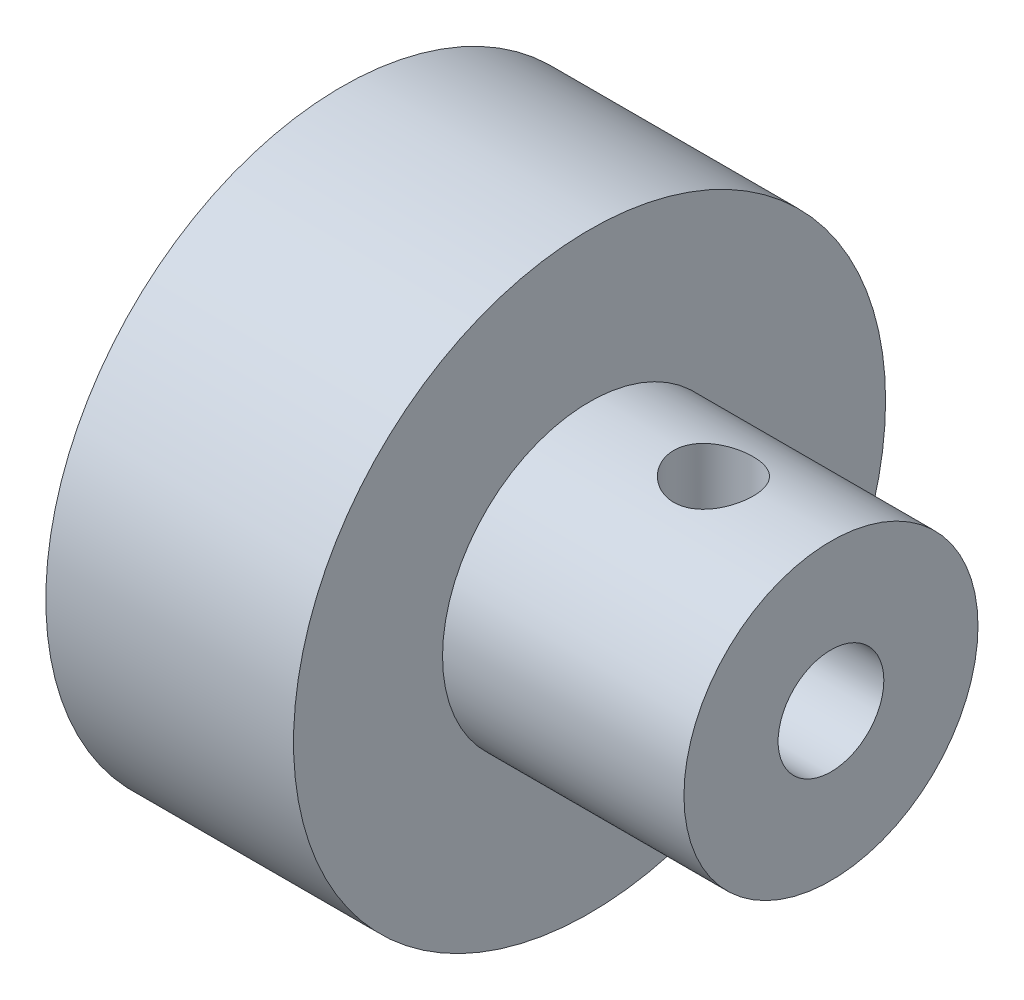
ISO-10303-21;
HEADER;
FILE_DESCRIPTION(('STEP AP214'),'2;1');
FILE_NAME('part.step','',(''),(''),'','','');
FILE_SCHEMA(('AUTOMOTIVE_DESIGN { 1 0 10303 214 1 1 1 1 }'));
ENDSEC;
DATA;
#1=APPLICATION_CONTEXT('core data for automotive mechanical design processes');
#2=APPLICATION_PROTOCOL_DEFINITION('international standard','automotive_design',2000,#1);
#3=PRODUCT_CONTEXT('',#1,'mechanical');
#4=PRODUCT('Part','Part','',(#3));
#5=PRODUCT_RELATED_PRODUCT_CATEGORY('part','',(#4));
#6=PRODUCT_DEFINITION_FORMATION('','',#4);
#7=PRODUCT_DEFINITION_CONTEXT('part definition',#1,'design');
#8=PRODUCT_DEFINITION('design','',#6,#7);
#9=PRODUCT_DEFINITION_SHAPE('','',#8);
#10=(LENGTH_UNIT() NAMED_UNIT(*) SI_UNIT(.MILLI.,.METRE.));
#11=(NAMED_UNIT(*) PLANE_ANGLE_UNIT() SI_UNIT($,.RADIAN.));
#12=(NAMED_UNIT(*) SI_UNIT($,.STERADIAN.) SOLID_ANGLE_UNIT());
#13=UNCERTAINTY_MEASURE_WITH_UNIT(LENGTH_MEASURE(1.E-05),#10,'distance_accuracy_value','');
#14=(GEOMETRIC_REPRESENTATION_CONTEXT(3) GLOBAL_UNCERTAINTY_ASSIGNED_CONTEXT((#13)) GLOBAL_UNIT_ASSIGNED_CONTEXT((#10,
#11,#12)) REPRESENTATION_CONTEXT('',''));
#15=CARTESIAN_POINT('',(0.,0.,0.));
#16=DIRECTION('',(0.,0.,1.));
#17=DIRECTION('',(1.,0.,0.));
#18=AXIS2_PLACEMENT_3D('',#15,#16,#17);
#19=CARTESIAN_POINT('',(-14.6892880689265,0.,0.));
#20=DIRECTION('',(1.,0.,0.));
#21=DIRECTION('',(0.,0.,-1.));
#22=AXIS2_PLACEMENT_3D('',#19,#20,#21);
#23=PLANE('',#22);
#24=CARTESIAN_POINT('',(-14.6892880689265,0.,0.));
#25=DIRECTION('',(1.,0.,0.));
#26=DIRECTION('',(0.,0.,-1.));
#27=AXIS2_PLACEMENT_3D('',#24,#25,#26);
#28=CIRCLE('',#27,8.89);
#29=CARTESIAN_POINT('',(-14.6892880689265,0.,-8.89));
#30=VERTEX_POINT('',#29);
#31=EDGE_CURVE('E122',#30,#30,#28,.T.);
#32=ORIENTED_EDGE('',*,*,#31,.F.);
#33=EDGE_LOOP('',(#32));
#34=FACE_BOUND('',#33,.T.);
#35=CARTESIAN_POINT('',(-14.6892880689265,0.,0.));
#36=DIRECTION('',(1.,0.,0.));
#37=DIRECTION('',(0.,0.,-1.));
#38=AXIS2_PLACEMENT_3D('',#35,#36,#37);
#39=CIRCLE('',#38,1.5875);
#40=CARTESIAN_POINT('',(-14.6892880689265,0.,-1.5875));
#41=VERTEX_POINT('',#40);
#42=EDGE_CURVE('E10',#41,#41,#39,.T.);
#43=ORIENTED_EDGE('',*,*,#42,.T.);
#44=EDGE_LOOP('',(#43));
#45=FACE_BOUND('',#44,.T.);
#46=ADVANCED_FACE('F45',(#34,#45),#23,.F.);
#47=CARTESIAN_POINT('',(0.,0.,0.));
#48=DIRECTION('',(1.,0.,0.));
#49=DIRECTION('',(0.,0.,-1.));
#50=AXIS2_PLACEMENT_3D('',#47,#48,#49);
#51=CYLINDRICAL_SURFACE('',#50,1.5875);
#52=CARTESIAN_POINT('',(-3.52955632665525,-1.05003255157876,1.190625));
#53=CARTESIAN_POINT('',(-3.47399587181116,-1.050045445975,1.19061880120499));
#54=CARTESIAN_POINT('',(-3.41839494567017,-1.05454741000987,1.18668886577821));
#55=CARTESIAN_POINT('',(-3.30942575328898,-1.07148823701036,1.17140301985762));
#56=CARTESIAN_POINT('',(-3.25606464842102,-1.08395075602632,1.16002497361435));
#57=CARTESIAN_POINT('',(-3.15365232330667,-1.11422757784016,1.13096547199778));
#58=CARTESIAN_POINT('',(-3.10455179760005,-1.13196567044321,1.11337314984434));
#59=CARTESIAN_POINT('',(-3.01016962218938,-1.17067373681068,1.0725995764387));
#60=CARTESIAN_POINT('',(-2.96488751182031,-1.19164331985289,1.04941900067592));
#61=CARTESIAN_POINT('',(-2.86906679457896,-1.2396574216291,0.992504284125244));
#62=CARTESIAN_POINT('',(-2.81941365386299,-1.26705442557768,0.957576618231006));
#63=CARTESIAN_POINT('',(-2.72586423782545,-1.321761740015,0.880535424277007));
#64=CARTESIAN_POINT('',(-2.68197661082916,-1.34907186163527,0.83841131436972));
#65=CARTESIAN_POINT('',(-2.59224970284748,-1.40702174808774,0.737878090100433));
#66=CARTESIAN_POINT('',(-2.54784159057137,-1.43720281226121,0.677900035756593));
#67=CARTESIAN_POINT('',(-2.47019994883075,-1.49131980240358,0.548631836139916));
#68=CARTESIAN_POINT('',(-2.43694016553939,-1.51527037067959,0.479364114482458));
#69=CARTESIAN_POINT('',(-2.39194772596979,-1.54808443073509,0.355496037787019));
#70=CARTESIAN_POINT('',(-2.37674788172235,-1.55931958043549,0.302772801943451));
#71=CARTESIAN_POINT('',(-2.35370292208284,-1.57643223525434,0.194907383645006));
#72=CARTESIAN_POINT('',(-2.34585141687053,-1.58231439499439,0.139767346508667));
#73=CARTESIAN_POINT('',(-2.3379615754019,-1.58822529365106,0.0284679172687354));
#74=CARTESIAN_POINT('',(-2.33794354099396,-1.58823882295637,-0.0276937463004187));
#75=CARTESIAN_POINT('',(-2.34577181397461,-1.58237401411808,-0.139157199360015));
#76=CARTESIAN_POINT('',(-2.35361994258859,-1.57649431153499,-0.194458786708892));
#77=CARTESIAN_POINT('',(-2.37630191056096,-1.55965031243376,-0.300743297572916));
#78=CARTESIAN_POINT('',(-2.390887285725,-1.54886705851508,-0.351809262912558));
#79=CARTESIAN_POINT('',(-2.4262403676374,-1.52306558684007,-0.450596385005576));
#80=CARTESIAN_POINT('',(-2.44700942243758,-1.50804644569141,-0.498316809620447));
#81=CARTESIAN_POINT('',(-2.49651420867685,-1.472890802502,-0.594690931730129));
#82=CARTESIAN_POINT('',(-2.52586905334639,-1.45237629107677,-0.642886211616418));
#83=CARTESIAN_POINT('',(-2.59033870418185,-1.40859432596468,-0.733875255122699));
#84=CARTESIAN_POINT('',(-2.62545841877955,-1.38532453106985,-0.776664360293093));
#85=CARTESIAN_POINT('',(-2.70820235978188,-1.33265676661185,-0.864458871498921));
#86=CARTESIAN_POINT('',(-2.75692738711371,-1.30295376843929,-0.908244413225473));
#87=CARTESIAN_POINT('',(-2.86108752740517,-1.24401229387742,-0.987431949727556));
#88=CARTESIAN_POINT('',(-2.91652581815327,-1.21477404494797,-1.0228299505536));
#89=CARTESIAN_POINT('',(-3.02233568616272,-1.16537919386833,-1.07849357589208));
#90=CARTESIAN_POINT('',(-3.07155229386264,-1.14456844833299,-1.10036663076556));
#91=CARTESIAN_POINT('',(-3.17400814378189,-1.10757288373056,-1.13759771455097));
#92=CARTESIAN_POINT('',(-3.22723796990948,-1.09137763785656,-1.15297046685305));
#93=CARTESIAN_POINT('',(-3.32610783845392,-1.06870540179809,-1.17397518372094));
#94=CARTESIAN_POINT('',(-3.37116119808551,-1.06093847023265,-1.18093386412912));
#95=CARTESIAN_POINT('',(-3.46236972793073,-1.05120748322927,-1.18960709991958));
#96=CARTESIAN_POINT('',(-3.50852341207812,-1.04923600365031,-1.19132836468154));
#97=CARTESIAN_POINT('',(-3.60058027634364,-1.05142402102457,-1.18939683154219));
#98=CARTESIAN_POINT('',(-3.64648335801668,-1.05558577464436,-1.1857420555772));
#99=CARTESIAN_POINT('',(-3.73678552265678,-1.06934967402693,-1.17334131022126));
#100=CARTESIAN_POINT('',(-3.78118190127656,-1.0789611050858,-1.16458665082263));
#101=CARTESIAN_POINT('',(-3.88383714982548,-1.10670783140942,-1.13834830402645));
#102=CARTESIAN_POINT('',(-3.94106486507531,-1.12668703809744,-1.11882388129336));
#103=CARTESIAN_POINT('',(-4.05050053466959,-1.1710817723223,-1.07226796784258));
#104=CARTESIAN_POINT('',(-4.10269900600796,-1.19550543916301,-1.04522265503785));
#105=CARTESIAN_POINT('',(-4.20372710179345,-1.24704699135672,-0.983216332051275));
#106=CARTESIAN_POINT('',(-4.25237117215349,-1.27422976552798,-0.948008248603961));
#107=CARTESIAN_POINT('',(-4.34394549064199,-1.32832083103686,-0.870605343134578));
#108=CARTESIAN_POINT('',(-4.38687294449647,-1.3552289822489,-0.828407126793555));
#109=CARTESIAN_POINT('',(-4.47513243876106,-1.41255926707429,-0.727261145352264));
#110=CARTESIAN_POINT('',(-4.51894604749847,-1.44246738243752,-0.666667665064069));
#111=CARTESIAN_POINT('',(-4.59526153383188,-1.49584651911049,-0.536219092541945));
#112=CARTESIAN_POINT('',(-4.62778789366665,-1.519331448665,-0.46638450504254));
#113=CARTESIAN_POINT('',(-4.6713164823662,-1.55114153831888,-0.341912306313174));
#114=CARTESIAN_POINT('',(-4.68585703131764,-1.56190535686026,-0.289123483003683));
#115=CARTESIAN_POINT('',(-4.70758355872435,-1.57805648311366,-0.181264294065456));
#116=CARTESIAN_POINT('',(-4.71477611263438,-1.58344859766149,-0.126196014246044));
#117=CARTESIAN_POINT('',(-4.72138496195483,-1.58840143581668,-0.0151984122151932));
#118=CARTESIAN_POINT('',(-4.72078300292542,-1.58794847048757,0.040732624740999));
#119=CARTESIAN_POINT('',(-4.7117985398099,-1.58121987574774,0.151613402505125));
#120=CARTESIAN_POINT('',(-4.70341396297494,-1.57494269517078,0.206562877919334));
#121=CARTESIAN_POINT('',(-4.67971998694751,-1.55736449484373,0.312358036108632));
#122=CARTESIAN_POINT('',(-4.66461868273127,-1.54621460816847,0.363276543980955));
#123=CARTESIAN_POINT('',(-4.62827454957022,-1.51973534456514,0.461693691083551));
#124=CARTESIAN_POINT('',(-4.60703040691447,-1.50440507365769,0.50919159606487));
#125=CARTESIAN_POINT('',(-4.55644821368846,-1.46857753504696,0.605272235896156));
#126=CARTESIAN_POINT('',(-4.52646589988858,-1.44769167461642,0.653368356641274));
#127=CARTESIAN_POINT('',(-4.46073108946535,-1.403234954476,0.744073006806094));
#128=CARTESIAN_POINT('',(-4.42497328955946,-1.37966163294053,0.786676427329301));
#129=CARTESIAN_POINT('',(-4.34076456694763,-1.32640667727172,0.874017021494155));
#130=CARTESIAN_POINT('',(-4.29120199709983,-1.29643919738103,0.917509051614588));
#131=CARTESIAN_POINT('',(-4.18529854458473,-1.2371870295527,0.995959824095465));
#132=CARTESIAN_POINT('',(-4.12895518973873,-1.20790259531751,1.03091544004403));
#133=CARTESIAN_POINT('',(-4.0225677464992,-1.15926871150369,1.0850242722053));
#134=CARTESIAN_POINT('',(-3.97379043413193,-1.13913939849811,1.10595986530786));
#135=CARTESIAN_POINT('',(-3.87239051441715,-1.10357098191916,1.14145534685201));
#136=CARTESIAN_POINT('',(-3.81977855895137,-1.08811945745383,1.15603216594685));
#137=CARTESIAN_POINT('',(-3.72736817735019,-1.06785111060464,1.17472664594127));
#138=CARTESIAN_POINT('',(-3.68833246381845,-1.06124478398383,1.18065747665075));
#139=CARTESIAN_POINT('',(-3.60938984980979,-1.05233228217761,1.18860759763756));
#140=CARTESIAN_POINT('',(-3.56948353840617,-1.05002328532471,1.19062945461798));
#141=CARTESIAN_POINT('',(-3.52955632665525,-1.05003255157876,1.190625));
#142=B_SPLINE_CURVE_WITH_KNOTS('',3,(#52,#53,#54,#55,#56,#57,#58,#59,#60,#61,#62,#63,#64,#65,
#66,#67,#68,#69,#70,#71,#72,#73,#74,#75,#76,#77,#78,#79,#80,#81,#82,#83,#84,#85,#86,#87,#88,#89,
#90,#91,#92,#93,#94,#95,#96,#97,#98,#99,#100,#101,#102,#103,#104,#105,#106,#107,#108,#109,#110,
#111,#112,#113,#114,#115,#116,#117,#118,#119,#120,#121,#122,#123,#124,#125,#126,#127,#128,#129,
#130,#131,#132,#133,#134,#135,#136,#137,#138,#139,#140,#141),.UNSPECIFIED.,.T.,.F.,(4,2,2,2,2,2,
2,2,2,2,2,2,2,2,2,2,2,2,2,2,2,2,2,2,2,2,2,2,2,2,2,2,2,2,2,2,2,2,2,2,2,2,2,2,4),(0.,
0.166474597743314,0.333446217300251,0.498114149835984,0.662762187833673,0.861895093986152,
1.0613233713153,1.30147098182183,1.54104901534439,1.70837006939059,1.87554549222377,
2.04315417765196,2.21080167790273,2.37270731241696,2.53464826848756,2.71412370017785,
2.89375274442082,3.10871804281232,3.32378549783047,3.49646406272525,3.66874938249073,
3.80688854402059,3.9448506680219,4.08286356658931,4.22111232464965,4.41110709885653,
4.60145338469826,4.79856172215235,4.99576605498253,5.23599171487223,5.47569301565586,
5.64239486354326,5.80894740496725,5.97589007623953,6.14287722220568,6.30501670074205,
6.46719088019845,6.64773604163628,6.82844793934811,7.0449089208391,7.26144906140521,
7.43123259464913,7.6005612670708,7.72027294583552,7.83990599300725),.UNSPECIFIED.);
#143=CARTESIAN_POINT('',(-3.52955632665525,-1.05003255157876,1.190625));
#144=VERTEX_POINT('',#143);
#145=EDGE_CURVE('E95',#144,#144,#142,.T.);
#146=ORIENTED_EDGE('',*,*,#145,.F.);
#147=EDGE_LOOP('',(#146));
#148=FACE_BOUND('',#147,.T.);
#149=CARTESIAN_POINT('',(-3.52955632665525,1.05003255157876,1.190625));
#150=CARTESIAN_POINT('',(-3.58511678149935,1.050045445975,1.19061880120499));
#151=CARTESIAN_POINT('',(-3.64071770764034,1.05454741000987,1.18668886577821));
#152=CARTESIAN_POINT('',(-3.74968690002153,1.07148823701036,1.17140301985762));
#153=CARTESIAN_POINT('',(-3.80304800488949,1.08395075602632,1.16002497361435));
#154=CARTESIAN_POINT('',(-3.90546033000384,1.11422757784016,1.13096547199778));
#155=CARTESIAN_POINT('',(-3.95456085571046,1.13196567044321,1.11337314984434));
#156=CARTESIAN_POINT('',(-4.04894303112113,1.17067373681068,1.0725995764387));
#157=CARTESIAN_POINT('',(-4.0942251414902,1.19164331985289,1.04941900067592));
#158=CARTESIAN_POINT('',(-4.19004585873155,1.2396574216291,0.992504284125244));
#159=CARTESIAN_POINT('',(-4.23969899944752,1.26705442557768,0.957576618231007));
#160=CARTESIAN_POINT('',(-4.33324841548505,1.321761740015,0.880535424277007));
#161=CARTESIAN_POINT('',(-4.37713604248134,1.34907186163527,0.83841131436972));
#162=CARTESIAN_POINT('',(-4.46686295046303,1.40702174808774,0.737878090100434));
#163=CARTESIAN_POINT('',(-4.51127106273914,1.43720281226121,0.677900035756593));
#164=CARTESIAN_POINT('',(-4.58891270447975,1.49131980240358,0.548631836139916));
#165=CARTESIAN_POINT('',(-4.62217248777112,1.51527037067959,0.479364114482458));
#166=CARTESIAN_POINT('',(-4.66716492734071,1.54808443073509,0.355496037787019));
#167=CARTESIAN_POINT('',(-4.68236477158816,1.55931958043549,0.302772801943451));
#168=CARTESIAN_POINT('',(-4.70540973122767,1.57643223525434,0.194907383645006));
#169=CARTESIAN_POINT('',(-4.71326123643998,1.58231439499439,0.139767346508666));
#170=CARTESIAN_POINT('',(-4.72115107790861,1.58822529365106,0.0284679172687352));
#171=CARTESIAN_POINT('',(-4.72116911231655,1.58823882295637,-0.0276937463004189));
#172=CARTESIAN_POINT('',(-4.7133408393359,1.58237401411808,-0.139157199360016));
#173=CARTESIAN_POINT('',(-4.70549271072191,1.57649431153499,-0.194458786708892));
#174=CARTESIAN_POINT('',(-4.68281074274955,1.55965031243376,-0.300743297572916));
#175=CARTESIAN_POINT('',(-4.66822536758551,1.54886705851508,-0.351809262912558));
#176=CARTESIAN_POINT('',(-4.63287228567311,1.52306558684007,-0.450596385005576));
#177=CARTESIAN_POINT('',(-4.61210323087293,1.50804644569141,-0.498316809620447));
#178=CARTESIAN_POINT('',(-4.56259844463366,1.472890802502,-0.594690931730128));
#179=CARTESIAN_POINT('',(-4.53324359996412,1.45237629107677,-0.642886211616417));
#180=CARTESIAN_POINT('',(-4.46877394912866,1.40859432596468,-0.733875255122699));
#181=CARTESIAN_POINT('',(-4.43365423453096,1.38532453106985,-0.776664360293093));
#182=CARTESIAN_POINT('',(-4.35091029352863,1.33265676661185,-0.86445887149892));
#183=CARTESIAN_POINT('',(-4.3021852661968,1.30295376843929,-0.908244413225473));
#184=CARTESIAN_POINT('',(-4.19802512590534,1.24401229387742,-0.987431949727557));
#185=CARTESIAN_POINT('',(-4.14258683515724,1.21477404494797,-1.0228299505536));
#186=CARTESIAN_POINT('',(-4.03677696714779,1.16537919386833,-1.07849357589208));
#187=CARTESIAN_POINT('',(-3.98756035944787,1.14456844833299,-1.10036663076556));
#188=CARTESIAN_POINT('',(-3.88510450952862,1.10757288373056,-1.13759771455097));
#189=CARTESIAN_POINT('',(-3.83187468340103,1.09137763785656,-1.15297046685305));
#190=CARTESIAN_POINT('',(-3.73300481485659,1.06870540179809,-1.17397518372094));
#191=CARTESIAN_POINT('',(-3.687951455225,1.06093847023265,-1.18093386412912));
#192=CARTESIAN_POINT('',(-3.59674292537978,1.05120748322927,-1.18960709991958));
#193=CARTESIAN_POINT('',(-3.55058924123239,1.04923600365031,-1.19132836468154));
#194=CARTESIAN_POINT('',(-3.45853237696687,1.05142402102457,-1.18939683154219));
#195=CARTESIAN_POINT('',(-3.41262929529383,1.05558577464436,-1.1857420555772));
#196=CARTESIAN_POINT('',(-3.32232713065373,1.06934967402693,-1.17334131022126));
#197=CARTESIAN_POINT('',(-3.27793075203395,1.0789611050858,-1.16458665082263));
#198=CARTESIAN_POINT('',(-3.17527550348503,1.10670783140942,-1.13834830402645));
#199=CARTESIAN_POINT('',(-3.1180477882352,1.12668703809744,-1.11882388129336));
#200=CARTESIAN_POINT('',(-3.00861211864092,1.1710817723223,-1.07226796784258));
#201=CARTESIAN_POINT('',(-2.95641364730255,1.19550543916301,-1.04522265503785));
#202=CARTESIAN_POINT('',(-2.85538555151706,1.24704699135672,-0.983216332051275));
#203=CARTESIAN_POINT('',(-2.80674148115702,1.27422976552798,-0.948008248603961));
#204=CARTESIAN_POINT('',(-2.71516716266852,1.32832083103686,-0.870605343134578));
#205=CARTESIAN_POINT('',(-2.67223970881404,1.3552289822489,-0.828407126793555));
#206=CARTESIAN_POINT('',(-2.58398021454945,1.41255926707429,-0.727261145352264));
#207=CARTESIAN_POINT('',(-2.54016660581204,1.44246738243751,-0.66666766506407));
#208=CARTESIAN_POINT('',(-2.46385111947863,1.49584651911049,-0.536219092541946));
#209=CARTESIAN_POINT('',(-2.43132475964385,1.519331448665,-0.466384505042541));
#210=CARTESIAN_POINT('',(-2.3877961709443,1.55114153831888,-0.341912306313175));
#211=CARTESIAN_POINT('',(-2.37325562199287,1.56190535686026,-0.289123483003684));
#212=CARTESIAN_POINT('',(-2.35152909458616,1.57805648311366,-0.181264294065457));
#213=CARTESIAN_POINT('',(-2.34433654067613,1.58344859766149,-0.126196014246045));
#214=CARTESIAN_POINT('',(-2.33772769135568,1.58840143581668,-0.0151984122151944));
#215=CARTESIAN_POINT('',(-2.33832965038508,1.58794847048757,0.0407326247409978));
#216=CARTESIAN_POINT('',(-2.34731411350061,1.58121987574774,0.151613402505124));
#217=CARTESIAN_POINT('',(-2.35569869033556,1.57494269517078,0.206562877919333));
#218=CARTESIAN_POINT('',(-2.379392666363,1.55736449484374,0.312358036108631));
#219=CARTESIAN_POINT('',(-2.39449397057923,1.54621460816847,0.363276543980954));
#220=CARTESIAN_POINT('',(-2.43083810374029,1.51973534456514,0.46169369108355));
#221=CARTESIAN_POINT('',(-2.45208224639604,1.50440507365769,0.509191596064869));
#222=CARTESIAN_POINT('',(-2.50266443962205,1.46857753504696,0.605272235896155));
#223=CARTESIAN_POINT('',(-2.53264675342192,1.44769167461642,0.653368356641273));
#224=CARTESIAN_POINT('',(-2.59838156384516,1.403234954476,0.744073006806093));
#225=CARTESIAN_POINT('',(-2.63413936375105,1.37966163294053,0.7866764273293));
#226=CARTESIAN_POINT('',(-2.71834808636288,1.32640667727172,0.874017021494154));
#227=CARTESIAN_POINT('',(-2.76791065621068,1.29643919738103,0.917509051614587));
#228=CARTESIAN_POINT('',(-2.87381410872578,1.2371870295527,0.995959824095464));
#229=CARTESIAN_POINT('',(-2.93015746357177,1.20790259531751,1.03091544004403));
#230=CARTESIAN_POINT('',(-3.03654490681131,1.15926871150369,1.0850242722053));
#231=CARTESIAN_POINT('',(-3.08532221917858,1.13913939849812,1.10595986530786));
#232=CARTESIAN_POINT('',(-3.18672213889336,1.10357098191916,1.14145534685201));
#233=CARTESIAN_POINT('',(-3.23933409435914,1.08811945745383,1.15603216594685));
#234=CARTESIAN_POINT('',(-3.33174447596032,1.06785111060464,1.17472664594127));
#235=CARTESIAN_POINT('',(-3.37078018949206,1.06124478398383,1.18065747665075));
#236=CARTESIAN_POINT('',(-3.44972280350072,1.05233228217761,1.18860759763756));
#237=CARTESIAN_POINT('',(-3.48962911490434,1.05002328532471,1.19062945461798));
#238=CARTESIAN_POINT('',(-3.52955632665525,1.05003255157876,1.190625));
#239=B_SPLINE_CURVE_WITH_KNOTS('',3,(#149,#150,#151,#152,#153,#154,#155,#156,#157,#158,#159,
#160,#161,#162,#163,#164,#165,#166,#167,#168,#169,#170,#171,#172,#173,#174,#175,#176,#177,#178,
#179,#180,#181,#182,#183,#184,#185,#186,#187,#188,#189,#190,#191,#192,#193,#194,#195,#196,#197,
#198,#199,#200,#201,#202,#203,#204,#205,#206,#207,#208,#209,#210,#211,#212,#213,#214,#215,#216,
#217,#218,#219,#220,#221,#222,#223,#224,#225,#226,#227,#228,#229,#230,#231,#232,#233,#234,#235,
#236,#237,#238),.UNSPECIFIED.,.T.,.F.,(4,2,2,2,2,2,2,2,2,2,2,2,2,2,2,2,2,2,2,2,2,2,2,2,2,2,2,2,
2,2,2,2,2,2,2,2,2,2,2,2,2,2,2,2,4),(0.,0.166474597743314,0.333446217300251,0.498114149835984,
0.662762187833672,0.861895093986151,1.0613233713153,1.30147098182183,1.5410490153444,
1.70837006939059,1.87554549222377,2.04315417765196,2.21080167790273,2.37270731241696,
2.53464826848756,2.71412370017785,2.89375274442082,3.10871804281232,3.32378549783047,
3.49646406272525,3.66874938249073,3.80688854402059,3.9448506680219,4.08286356658931,
4.22111232464965,4.41110709885653,4.60145338469826,4.79856172215235,4.99576605498252,
5.23599171487223,5.47569301565586,5.64239486354326,5.80894740496724,5.97589007623953,
6.14287722220568,6.30501670074205,6.46719088019845,6.64773604163628,6.82844793934811,
7.0449089208391,7.26144906140521,7.43123259464912,7.60056126707079,7.72027294583552,
7.83990599300725),.UNSPECIFIED.);
#240=CARTESIAN_POINT('',(-3.52955632665525,1.05003255157876,1.190625));
#241=VERTEX_POINT('',#240);
#242=EDGE_CURVE('E89',#241,#241,#239,.T.);
#243=ORIENTED_EDGE('',*,*,#242,.F.);
#244=EDGE_LOOP('',(#243));
#245=FACE_BOUND('',#244,.T.);
#246=CARTESIAN_POINT('',(0.,0.,0.));
#247=DIRECTION('',(1.,0.,0.));
#248=DIRECTION('',(0.,0.,-1.));
#249=AXIS2_PLACEMENT_3D('',#246,#247,#248);
#250=CIRCLE('',#249,1.5875);
#251=CARTESIAN_POINT('',(0.,0.,-1.5875));
#252=VERTEX_POINT('',#251);
#253=EDGE_CURVE('E58',#252,#252,#250,.T.);
#254=ORIENTED_EDGE('',*,*,#253,.T.);
#255=EDGE_LOOP('',(#254));
#256=FACE_BOUND('',#255,.T.);
#257=ORIENTED_EDGE('',*,*,#42,.F.);
#258=EDGE_LOOP('',(#257));
#259=FACE_BOUND('',#258,.T.);
#260=ADVANCED_FACE('F100',(#148,#245,#256,#259),#51,.F.);
#261=CARTESIAN_POINT('',(0.,0.,0.));
#262=DIRECTION('',(1.,0.,0.));
#263=DIRECTION('',(0.,0.,-1.));
#264=AXIS2_PLACEMENT_3D('',#261,#262,#263);
#265=PLANE('',#264);
#266=CARTESIAN_POINT('',(0.,0.,0.));
#267=DIRECTION('',(1.,0.,0.));
#268=DIRECTION('',(0.,0.,-1.));
#269=AXIS2_PLACEMENT_3D('',#266,#267,#268);
#270=CIRCLE('',#269,4.415252691);
#271=CARTESIAN_POINT('',(0.,0.,-4.415252691));
#272=VERTEX_POINT('',#271);
#273=EDGE_CURVE('E64',#272,#272,#270,.T.);
#274=ORIENTED_EDGE('',*,*,#273,.T.);
#275=EDGE_LOOP('',(#274));
#276=FACE_BOUND('',#275,.T.);
#277=ORIENTED_EDGE('',*,*,#253,.F.);
#278=EDGE_LOOP('',(#277));
#279=FACE_BOUND('',#278,.T.);
#280=ADVANCED_FACE('F103',(#276,#279),#265,.T.);
#281=CARTESIAN_POINT('',(0.,0.,0.));
#282=DIRECTION('',(1.,0.,0.));
#283=DIRECTION('',(0.,0.,-1.));
#284=AXIS2_PLACEMENT_3D('',#281,#282,#283);
#285=CYLINDRICAL_SURFACE('',#284,4.415252691);
#286=CARTESIAN_POINT('',(-3.52955632665525,-4.25169006805032,1.190625));
#287=CARTESIAN_POINT('',(-3.59511599877039,-4.251691176619,1.19062347597973));
#288=CARTESIAN_POINT('',(-3.66069167898018,-4.25322300990569,1.18519166158049));
#289=CARTESIAN_POINT('',(-3.78994721266712,-4.25916599240044,1.16365034480051));
#290=CARTESIAN_POINT('',(-3.85362612715593,-4.26357854371905,1.14753564275796));
#291=CARTESIAN_POINT('',(-3.97719952968807,-4.27474768001734,1.10519838730939));
#292=CARTESIAN_POINT('',(-4.03709927933392,-4.28150091702969,1.078990264968));
#293=CARTESIAN_POINT('',(-4.15166159185513,-4.29658621442784,1.01725553804566));
#294=CARTESIAN_POINT('',(-4.20632371378391,-4.30491840756763,0.981728149831684));
#295=CARTESIAN_POINT('',(-4.31025715095881,-4.32246159876223,0.901391658204146));
#296=CARTESIAN_POINT('',(-4.35937467517498,-4.33168845700272,0.856387013126395));
#297=CARTESIAN_POINT('',(-4.44946425402239,-4.34984457462752,0.758793943328777));
#298=CARTESIAN_POINT('',(-4.49043544802054,-4.35877380248528,0.706204718334423));
#299=CARTESIAN_POINT('',(-4.56371290169087,-4.37550583064641,0.593866540014524));
#300=CARTESIAN_POINT('',(-4.59586593395515,-4.38328774134446,0.534014255690074));
#301=CARTESIAN_POINT('',(-4.64959449569118,-4.39666615036575,0.409508380045214));
#302=CARTESIAN_POINT('',(-4.67117185063095,-4.40226302581402,0.344855619555197));
#303=CARTESIAN_POINT('',(-4.7026378651628,-4.41052859541411,0.214189641949939));
#304=CARTESIAN_POINT('',(-4.71278821293313,-4.41326274128806,0.148243655693694));
#305=CARTESIAN_POINT('',(-4.72193575424636,-4.41572377213078,0.0155319483055854));
#306=CARTESIAN_POINT('',(-4.72093485504958,-4.41545117136037,-0.0512336306955063));
#307=CARTESIAN_POINT('',(-4.70799186155778,-4.41197723607801,-0.181866615698292));
#308=CARTESIAN_POINT('',(-4.69633255197128,-4.40885160035021,-0.245764360886089));
#309=CARTESIAN_POINT('',(-4.66286098428318,-4.4001123459816,-0.370660407046825));
#310=CARTESIAN_POINT('',(-4.64104814076635,-4.39449858388553,-0.431658540615359));
#311=CARTESIAN_POINT('',(-4.58767415743353,-4.3813022193328,-0.549741474882018));
#312=CARTESIAN_POINT('',(-4.5560168168691,-4.37370031061068,-0.606780546141582));
#313=CARTESIAN_POINT('',(-4.48392649023156,-4.3573456645121,-0.714832666649301));
#314=CARTESIAN_POINT('',(-4.44349176030272,-4.34859269858473,-0.765844515318989));
#315=CARTESIAN_POINT('',(-4.3534961559919,-4.33055948158832,-0.862082150438345));
#316=CARTESIAN_POINT('',(-4.30368875651213,-4.32127130327184,-0.907076189213466));
#317=CARTESIAN_POINT('',(-4.19713965596272,-4.30346162423007,-0.988130193293261));
#318=CARTESIAN_POINT('',(-4.14039751246509,-4.29494017248124,-1.02418958813405));
#319=CARTESIAN_POINT('',(-4.02107804641693,-4.27959641275362,-1.08653250506268));
#320=CARTESIAN_POINT('',(-3.95846555367243,-4.27278538116756,-1.11275168545723));
#321=CARTESIAN_POINT('',(-3.82949145099287,-4.26177306306929,-1.1542148946597));
#322=CARTESIAN_POINT('',(-3.76313079966075,-4.25757111254434,-1.16946171609703));
#323=CARTESIAN_POINT('',(-3.63071480013154,-4.25239455534847,-1.18814505301411));
#324=CARTESIAN_POINT('',(-3.56471195287586,-4.25132535952672,-1.19192783394738));
#325=CARTESIAN_POINT('',(-3.43301653716165,-4.25227633494584,-1.18853085025755));
#326=CARTESIAN_POINT('',(-3.36732393561713,-4.25429616893886,-1.18135228235059));
#327=CARTESIAN_POINT('',(-3.23945712197249,-4.26110612427251,-1.15654192175233));
#328=CARTESIAN_POINT('',(-3.17723903355991,-4.26584070645388,-1.1391195239561));
#329=CARTESIAN_POINT('',(-3.05660848459353,-4.27749214942329,-1.09455212146893));
#330=CARTESIAN_POINT('',(-2.99819653048329,-4.28440929991098,-1.06740582602754));
#331=CARTESIAN_POINT('',(-2.88539108724841,-4.29983971332674,-1.00346223602038));
#332=CARTESIAN_POINT('',(-2.83111699071054,-4.30838527202779,-0.966462290786253));
#333=CARTESIAN_POINT('',(-2.7294208561181,-4.3260342329751,-0.884111974805138));
#334=CARTESIAN_POINT('',(-2.682000139437,-4.33513774231708,-0.838759997558703));
#335=CARTESIAN_POINT('',(-2.59391293894015,-4.35320344914611,-0.739389084094894));
#336=CARTESIAN_POINT('',(-2.55348827860127,-4.3621534627602,-0.685153122574773));
#337=CARTESIAN_POINT('',(-2.4823163552627,-4.37862734228488,-0.570464741690044));
#338=CARTESIAN_POINT('',(-2.45156857699925,-4.38615128412085,-0.510012653542246));
#339=CARTESIAN_POINT('',(-2.40090770534434,-4.39887676482232,-0.385033587186002));
#340=CARTESIAN_POINT('',(-2.38091338672951,-4.40409565942185,-0.320541386917166));
#341=CARTESIAN_POINT('',(-2.35209312783206,-4.41169945557913,-0.188950315505051));
#342=CARTESIAN_POINT('',(-2.34326465230737,-4.41408500045093,-0.121852039647414));
#343=CARTESIAN_POINT('',(-2.33718848944726,-4.41572217357304,0.0107895083278738));
#344=CARTESIAN_POINT('',(-2.33958645239412,-4.41506969710724,0.0763155916128253));
#345=CARTESIAN_POINT('',(-2.3550702549163,-4.41092178598981,0.205995658518283));
#346=CARTESIAN_POINT('',(-2.36815567691681,-4.40742646241244,0.270149695646163));
#347=CARTESIAN_POINT('',(-2.40444079415259,-4.39800538025743,0.394828131586032));
#348=CARTESIAN_POINT('',(-2.42756715723022,-4.39209726132643,0.455375293656666));
#349=CARTESIAN_POINT('',(-2.48321230083667,-4.37846767249362,0.571764446186615));
#350=CARTESIAN_POINT('',(-2.51573242131299,-4.37074594392371,0.627605763924404));
#351=CARTESIAN_POINT('',(-2.59027096524959,-4.3540525502408,0.734641939906968));
#352=CARTESIAN_POINT('',(-2.63252328230347,-4.34505264271661,0.785669498806838));
#353=CARTESIAN_POINT('',(-2.72488517249715,-4.32692930608533,0.880029868989179));
#354=CARTESIAN_POINT('',(-2.77499682568571,-4.31780584486427,0.92336063674924));
#355=CARTESIAN_POINT('',(-2.88301906459219,-4.30023016426468,1.00206961142781));
#356=CARTESIAN_POINT('',(-2.94108048172793,-4.29179780826929,1.03724565323226));
#357=CARTESIAN_POINT('',(-3.06251350765595,-4.27684230518393,1.09728753213187));
#358=CARTESIAN_POINT('',(-3.12588168666601,-4.27031793701783,1.12215996760516));
#359=CARTESIAN_POINT('',(-3.24575227828611,-4.26080134647113,1.15771719494577));
#360=CARTESIAN_POINT('',(-3.30174598065877,-4.25741263599761,1.17002824444013));
#361=CARTESIAN_POINT('',(-3.41500792675399,-4.25285664584932,1.18648232243674));
#362=CARTESIAN_POINT('',(-3.47227601662568,-4.25168909947992,1.19062633155567));
#363=CARTESIAN_POINT('',(-3.52955632665525,-4.25169006805032,1.190625));
#364=B_SPLINE_CURVE_WITH_KNOTS('',3,(#286,#287,#288,#289,#290,#291,#292,#293,#294,#295,#296,
#297,#298,#299,#300,#301,#302,#303,#304,#305,#306,#307,#308,#309,#310,#311,#312,#313,#314,#315,
#316,#317,#318,#319,#320,#321,#322,#323,#324,#325,#326,#327,#328,#329,#330,#331,#332,#333,#334,
#335,#336,#337,#338,#339,#340,#341,#342,#343,#344,#345,#346,#347,#348,#349,#350,#351,#352,#353,
#354,#355,#356,#357,#358,#359,#360,#361,#362,#363),.UNSPECIFIED.,.T.,.F.,(4,2,2,2,2,2,2,2,2,2,2,
2,2,2,2,2,2,2,2,2,2,2,2,2,2,2,2,2,2,2,2,2,2,2,2,2,2,2,4),(0.,0.196468333389698,
0.393032363720886,0.589316393810081,0.785616934210901,0.986454376134823,1.18731302461584,
1.39146781931618,1.59558736242935,1.79493074518246,1.99424003364198,2.18841012250997,
2.38259140789413,2.57873325841871,2.77491411332588,2.97725002002328,3.17959884224399,
3.38324860849818,3.58684652449334,3.78423031623212,3.98159255994045,4.17505425943644,
4.36854164856618,4.56636520174791,4.76422684577891,4.96795243689376,5.17166717842122,
5.37382076363926,5.5759284409638,5.77170061384406,5.96746513798252,6.16182336803048,
6.3562093354919,6.55587252952612,6.75558865579089,6.95982452406667,7.16392939776366,
7.33560686607733,7.50726371981802),.UNSPECIFIED.);
#365=CARTESIAN_POINT('',(-3.52955632665525,-4.25169006805032,1.190625));
#366=VERTEX_POINT('',#365);
#367=EDGE_CURVE('E48',#366,#366,#364,.T.);
#368=ORIENTED_EDGE('',*,*,#367,.F.);
#369=EDGE_LOOP('',(#368));
#370=FACE_BOUND('',#369,.T.);
#371=CARTESIAN_POINT('',(-3.52955632665525,4.25169006805032,1.190625));
#372=CARTESIAN_POINT('',(-3.46399665454011,4.251691176619,1.19062347597973));
#373=CARTESIAN_POINT('',(-3.39842097433033,4.25322300990569,1.18519166158049));
#374=CARTESIAN_POINT('',(-3.26916544064339,4.25916599240044,1.16365034480051));
#375=CARTESIAN_POINT('',(-3.20548652615458,4.26357854371905,1.14753564275796));
#376=CARTESIAN_POINT('',(-3.08191312362244,4.27474768001734,1.10519838730939));
#377=CARTESIAN_POINT('',(-3.02201337397659,4.28150091702969,1.078990264968));
#378=CARTESIAN_POINT('',(-2.90745106145538,4.29658621442784,1.01725553804566));
#379=CARTESIAN_POINT('',(-2.8527889395266,4.30491840756763,0.981728149831684));
#380=CARTESIAN_POINT('',(-2.7488555023517,4.32246159876223,0.901391658204145));
#381=CARTESIAN_POINT('',(-2.69973797813553,4.33168845700273,0.856387013126395));
#382=CARTESIAN_POINT('',(-2.60964839928812,4.34984457462752,0.758793943328777));
#383=CARTESIAN_POINT('',(-2.56867720528997,4.35877380248528,0.706204718334422));
#384=CARTESIAN_POINT('',(-2.49539975161963,4.37550583064641,0.593866540014524));
#385=CARTESIAN_POINT('',(-2.46324671935536,4.38328774134447,0.534014255690073));
#386=CARTESIAN_POINT('',(-2.40951815761933,4.39666615036575,0.409508380045214));
#387=CARTESIAN_POINT('',(-2.38794080267956,4.40226302581402,0.344855619555197));
#388=CARTESIAN_POINT('',(-2.3564747881477,4.41052859541411,0.214189641949939));
#389=CARTESIAN_POINT('',(-2.34632444037738,4.41326274128806,0.148243655693694));
#390=CARTESIAN_POINT('',(-2.33717689906415,4.41572377213078,0.0155319483055853));
#391=CARTESIAN_POINT('',(-2.33817779826093,4.41545117136037,-0.0512336306955064));
#392=CARTESIAN_POINT('',(-2.35112079175273,4.41197723607801,-0.181866615698292));
#393=CARTESIAN_POINT('',(-2.36278010133923,4.40885160035021,-0.245764360886089));
#394=CARTESIAN_POINT('',(-2.39625166902733,4.4001123459816,-0.370660407046825));
#395=CARTESIAN_POINT('',(-2.41806451254416,4.39449858388553,-0.431658540615359));
#396=CARTESIAN_POINT('',(-2.47143849587698,4.3813022193328,-0.549741474882018));
#397=CARTESIAN_POINT('',(-2.50309583644141,4.37370031061068,-0.606780546141582));
#398=CARTESIAN_POINT('',(-2.57518616307895,4.35734566451211,-0.714832666649301));
#399=CARTESIAN_POINT('',(-2.61562089300779,4.34859269858473,-0.765844515318989));
#400=CARTESIAN_POINT('',(-2.7056164973186,4.33055948158832,-0.862082150438345));
#401=CARTESIAN_POINT('',(-2.75542389679838,4.32127130327184,-0.907076189213466));
#402=CARTESIAN_POINT('',(-2.86197299734778,4.30346162423007,-0.988130193293261));
#403=CARTESIAN_POINT('',(-2.91871514084542,4.29494017248124,-1.02418958813405));
#404=CARTESIAN_POINT('',(-3.03803460689358,4.27959641275362,-1.08653250506268));
#405=CARTESIAN_POINT('',(-3.10064709963808,4.27278538116756,-1.11275168545723));
#406=CARTESIAN_POINT('',(-3.22962120231764,4.26177306306929,-1.1542148946597));
#407=CARTESIAN_POINT('',(-3.29598185364975,4.25757111254434,-1.16946171609703));
#408=CARTESIAN_POINT('',(-3.42839785317897,4.25239455534847,-1.18814505301411));
#409=CARTESIAN_POINT('',(-3.49440070043465,4.25132535952672,-1.19192783394738));
#410=CARTESIAN_POINT('',(-3.62609611614886,4.25227633494584,-1.18853085025755));
#411=CARTESIAN_POINT('',(-3.69178871769338,4.25429616893886,-1.18135228235059));
#412=CARTESIAN_POINT('',(-3.81965553133802,4.26110612427251,-1.15654192175233));
#413=CARTESIAN_POINT('',(-3.8818736197506,4.26584070645388,-1.1391195239561));
#414=CARTESIAN_POINT('',(-4.00250416871698,4.27749214942329,-1.09455212146893));
#415=CARTESIAN_POINT('',(-4.06091612282722,4.28440929991098,-1.06740582602754));
#416=CARTESIAN_POINT('',(-4.17372156606209,4.29983971332674,-1.00346223602038));
#417=CARTESIAN_POINT('',(-4.22799566259997,4.30838527202779,-0.966462290786253));
#418=CARTESIAN_POINT('',(-4.32969179719241,4.3260342329751,-0.884111974805138));
#419=CARTESIAN_POINT('',(-4.37711251387351,4.33513774231708,-0.838759997558703));
#420=CARTESIAN_POINT('',(-4.46519971437036,4.35320344914611,-0.739389084094893));
#421=CARTESIAN_POINT('',(-4.50562437470924,4.3621534627602,-0.685153122574773));
#422=CARTESIAN_POINT('',(-4.57679629804781,4.37862734228488,-0.570464741690044));
#423=CARTESIAN_POINT('',(-4.60754407631126,4.38615128412085,-0.510012653542246));
#424=CARTESIAN_POINT('',(-4.65820494796617,4.39887676482232,-0.385033587186003));
#425=CARTESIAN_POINT('',(-4.67819926658099,4.40409565942185,-0.320541386917167));
#426=CARTESIAN_POINT('',(-4.70701952547845,4.41169945557913,-0.188950315505052));
#427=CARTESIAN_POINT('',(-4.71584800100314,4.41408500045093,-0.121852039647415));
#428=CARTESIAN_POINT('',(-4.72192416386324,4.41572217357304,0.0107895083278732));
#429=CARTESIAN_POINT('',(-4.71952620091639,4.41506969710724,0.0763155916128247));
#430=CARTESIAN_POINT('',(-4.70404239839421,4.41092178598981,0.205995658518283));
#431=CARTESIAN_POINT('',(-4.6909569763937,4.40742646241244,0.270149695646162));
#432=CARTESIAN_POINT('',(-4.65467185915791,4.39800538025743,0.394828131586032));
#433=CARTESIAN_POINT('',(-4.63154549608029,4.39209726132643,0.455375293656665));
#434=CARTESIAN_POINT('',(-4.57590035247384,4.37846767249363,0.571764446186615));
#435=CARTESIAN_POINT('',(-4.54338023199752,4.37074594392371,0.627605763924404));
#436=CARTESIAN_POINT('',(-4.46884168806092,4.3540525502408,0.734641939906967));
#437=CARTESIAN_POINT('',(-4.42658937100704,4.34505264271661,0.785669498806838));
#438=CARTESIAN_POINT('',(-4.33422748081336,4.32692930608533,0.880029868989178));
#439=CARTESIAN_POINT('',(-4.2841158276248,4.31780584486427,0.92336063674924));
#440=CARTESIAN_POINT('',(-4.17609358871832,4.30023016426468,1.00206961142781));
#441=CARTESIAN_POINT('',(-4.11803217158258,4.29179780826929,1.03724565323226));
#442=CARTESIAN_POINT('',(-3.99659914565456,4.27684230518392,1.09728753213187));
#443=CARTESIAN_POINT('',(-3.9332309666445,4.27031793701783,1.12215996760516));
#444=CARTESIAN_POINT('',(-3.8133603750244,4.26080134647113,1.15771719494577));
#445=CARTESIAN_POINT('',(-3.75736667265174,4.25741263599761,1.17002824444013));
#446=CARTESIAN_POINT('',(-3.64410472655652,4.25285664584932,1.18648232243674));
#447=CARTESIAN_POINT('',(-3.58683663668483,4.25168909947992,1.19062633155567));
#448=CARTESIAN_POINT('',(-3.52955632665525,4.25169006805032,1.190625));
#449=B_SPLINE_CURVE_WITH_KNOTS('',3,(#371,#372,#373,#374,#375,#376,#377,#378,#379,#380,#381,
#382,#383,#384,#385,#386,#387,#388,#389,#390,#391,#392,#393,#394,#395,#396,#397,#398,#399,#400,
#401,#402,#403,#404,#405,#406,#407,#408,#409,#410,#411,#412,#413,#414,#415,#416,#417,#418,#419,
#420,#421,#422,#423,#424,#425,#426,#427,#428,#429,#430,#431,#432,#433,#434,#435,#436,#437,#438,
#439,#440,#441,#442,#443,#444,#445,#446,#447,#448),.UNSPECIFIED.,.T.,.F.,(4,2,2,2,2,2,2,2,2,2,2,
2,2,2,2,2,2,2,2,2,2,2,2,2,2,2,2,2,2,2,2,2,2,2,2,2,2,2,4),(0.,0.196468333389698,
0.393032363720886,0.589316393810081,0.785616934210902,0.986454376134823,1.18731302461584,
1.39146781931618,1.59558736242935,1.79493074518246,1.99424003364198,2.18841012250997,
2.38259140789413,2.57873325841871,2.77491411332588,2.97725002002328,3.17959884224399,
3.38324860849818,3.58684652449334,3.78423031623212,3.98159255994045,4.17505425943644,
4.36854164856618,4.56636520174792,4.76422684577891,4.96795243689376,5.17166717842122,
5.37382076363926,5.57592844096381,5.77170061384406,5.96746513798253,6.16182336803048,
6.3562093354919,6.55587252952613,6.75558865579089,6.95982452406668,7.16392939776366,
7.33560686607733,7.50726371981803),.UNSPECIFIED.);
#450=CARTESIAN_POINT('',(-3.52955632665525,4.25169006805032,1.190625));
#451=VERTEX_POINT('',#450);
#452=EDGE_CURVE('E67',#451,#451,#449,.T.);
#453=ORIENTED_EDGE('',*,*,#452,.F.);
#454=EDGE_LOOP('',(#453));
#455=FACE_BOUND('',#454,.T.);
#456=CARTESIAN_POINT('',(-7.25007780225988,0.,0.));
#457=DIRECTION('',(1.,0.,0.));
#458=DIRECTION('',(0.,0.,-1.));
#459=AXIS2_PLACEMENT_3D('',#456,#457,#458);
#460=CIRCLE('',#459,4.415252691);
#461=CARTESIAN_POINT('',(-7.25007780225988,0.,-4.415252691));
#462=VERTEX_POINT('',#461);
#463=EDGE_CURVE('E129',#462,#462,#460,.T.);
#464=ORIENTED_EDGE('',*,*,#463,.T.);
#465=EDGE_LOOP('',(#464));
#466=FACE_BOUND('',#465,.T.);
#467=ORIENTED_EDGE('',*,*,#273,.F.);
#468=EDGE_LOOP('',(#467));
#469=FACE_BOUND('',#468,.T.);
#470=ADVANCED_FACE('F73',(#370,#455,#466,#469),#285,.T.);
#471=CARTESIAN_POINT('',(-7.25007780225988,0.,0.));
#472=DIRECTION('',(1.,0.,0.));
#473=DIRECTION('',(0.,0.,-1.));
#474=AXIS2_PLACEMENT_3D('',#471,#472,#473);
#475=PLANE('',#474);
#476=CARTESIAN_POINT('',(-7.25007780225988,0.,0.));
#477=DIRECTION('',(1.,0.,0.));
#478=DIRECTION('',(0.,0.,-1.));
#479=AXIS2_PLACEMENT_3D('',#476,#477,#478);
#480=CIRCLE('',#479,8.89);
#481=CARTESIAN_POINT('',(-7.25007780225988,0.,-8.89));
#482=VERTEX_POINT('',#481);
#483=EDGE_CURVE('E125',#482,#482,#480,.T.);
#484=ORIENTED_EDGE('',*,*,#483,.T.);
#485=EDGE_LOOP('',(#484));
#486=FACE_BOUND('',#485,.T.);
#487=ORIENTED_EDGE('',*,*,#463,.F.);
#488=EDGE_LOOP('',(#487));
#489=FACE_BOUND('',#488,.T.);
#490=ADVANCED_FACE('F113',(#486,#489),#475,.T.);
#491=CARTESIAN_POINT('',(0.,0.,0.));
#492=DIRECTION('',(1.,0.,0.));
#493=DIRECTION('',(0.,0.,-1.));
#494=AXIS2_PLACEMENT_3D('',#491,#492,#493);
#495=CYLINDRICAL_SURFACE('',#494,8.89);
#496=ORIENTED_EDGE('',*,*,#31,.T.);
#497=EDGE_LOOP('',(#496));
#498=FACE_BOUND('',#497,.T.);
#499=ORIENTED_EDGE('',*,*,#483,.F.);
#500=EDGE_LOOP('',(#499));
#501=FACE_BOUND('',#500,.T.);
#502=ADVANCED_FACE('F82',(#498,#501),#495,.T.);
#503=CARTESIAN_POINT('',(-3.52955632665525,-8.89,0.));
#504=DIRECTION('',(0.,1.,0.));
#505=DIRECTION('',(0.,0.,1.));
#506=AXIS2_PLACEMENT_3D('',#503,#504,#505);
#507=CYLINDRICAL_SURFACE('',#506,1.190625);
#508=ORIENTED_EDGE('',*,*,#242,.T.);
#509=EDGE_LOOP('',(#508));
#510=FACE_BOUND('',#509,.T.);
#511=ORIENTED_EDGE('',*,*,#452,.T.);
#512=EDGE_LOOP('',(#511));
#513=FACE_BOUND('',#512,.T.);
#514=ADVANCED_FACE('F77',(#510,#513),#507,.F.);
#515=ORIENTED_EDGE('',*,*,#145,.T.);
#516=EDGE_LOOP('',(#515));
#517=FACE_BOUND('',#516,.T.);
#518=ORIENTED_EDGE('',*,*,#367,.T.);
#519=EDGE_LOOP('',(#518));
#520=FACE_BOUND('',#519,.T.);
#521=ADVANCED_FACE('F81',(#517,#520),#507,.F.);
#522=CLOSED_SHELL('',(#46,#260,#280,#470,#490,#502,#514,#521));
#523=MANIFOLD_SOLID_BREP('B2',#522);
#524=ADVANCED_BREP_SHAPE_REPRESENTATION('',(#18,#523),#14);
#525=SHAPE_DEFINITION_REPRESENTATION(#9,#524);
ENDSEC;
END-ISO-10303-21;
